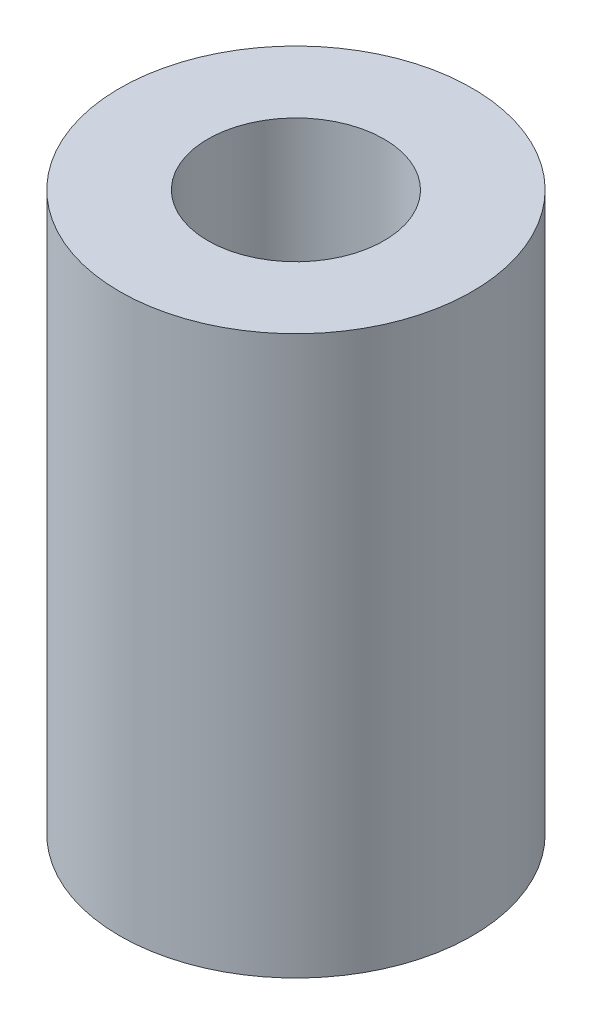
ISO-10303-21;
HEADER;
FILE_DESCRIPTION(('STEP AP214'),'2;1');
FILE_NAME('part.step','',(''),(''),'','','');
FILE_SCHEMA(('AUTOMOTIVE_DESIGN { 1 0 10303 214 1 1 1 1 }'));
ENDSEC;
DATA;
#1=APPLICATION_CONTEXT('core data for automotive mechanical design processes');
#2=APPLICATION_PROTOCOL_DEFINITION('international standard','automotive_design',2000,#1);
#3=PRODUCT_CONTEXT('',#1,'mechanical');
#4=PRODUCT('Part','Part','',(#3));
#5=PRODUCT_RELATED_PRODUCT_CATEGORY('part','',(#4));
#6=PRODUCT_DEFINITION_FORMATION('','',#4);
#7=PRODUCT_DEFINITION_CONTEXT('part definition',#1,'design');
#8=PRODUCT_DEFINITION('design','',#6,#7);
#9=PRODUCT_DEFINITION_SHAPE('','',#8);
#10=(LENGTH_UNIT() NAMED_UNIT(*) SI_UNIT(.MILLI.,.METRE.));
#11=(NAMED_UNIT(*) PLANE_ANGLE_UNIT() SI_UNIT($,.RADIAN.));
#12=(NAMED_UNIT(*) SI_UNIT($,.STERADIAN.) SOLID_ANGLE_UNIT());
#13=UNCERTAINTY_MEASURE_WITH_UNIT(LENGTH_MEASURE(1.E-05),#10,'distance_accuracy_value','');
#14=(GEOMETRIC_REPRESENTATION_CONTEXT(3) GLOBAL_UNCERTAINTY_ASSIGNED_CONTEXT((#13)) GLOBAL_UNIT_ASSIGNED_CONTEXT((#10,
#11,#12)) REPRESENTATION_CONTEXT('',''));
#15=CARTESIAN_POINT('',(0.,0.,0.));
#16=DIRECTION('',(0.,0.,1.));
#17=DIRECTION('',(1.,0.,0.));
#18=AXIS2_PLACEMENT_3D('',#15,#16,#17);
#19=CARTESIAN_POINT('',(0.,19.,0.));
#20=DIRECTION('',(0.,1.,0.));
#21=DIRECTION('',(0.,0.,1.));
#22=AXIS2_PLACEMENT_3D('',#19,#20,#21);
#23=PLANE('',#22);
#24=CARTESIAN_POINT('',(0.,19.,0.));
#25=DIRECTION('',(0.,1.,0.));
#26=DIRECTION('',(0.,0.,1.));
#27=AXIS2_PLACEMENT_3D('',#24,#25,#26);
#28=CIRCLE('',#27,6.);
#29=CARTESIAN_POINT('',(0.,19.,6.));
#30=VERTEX_POINT('',#29);
#31=EDGE_CURVE('E10',#30,#30,#28,.T.);
#32=ORIENTED_EDGE('',*,*,#31,.T.);
#33=EDGE_LOOP('',(#32));
#34=FACE_BOUND('',#33,.T.);
#35=CARTESIAN_POINT('',(0.,19.,0.));
#36=DIRECTION('',(0.,1.,0.));
#37=DIRECTION('',(0.,0.,1.));
#38=AXIS2_PLACEMENT_3D('',#35,#36,#37);
#39=CIRCLE('',#38,3.);
#40=CARTESIAN_POINT('',(0.,19.,3.));
#41=VERTEX_POINT('',#40);
#42=EDGE_CURVE('E41',#41,#41,#39,.T.);
#43=ORIENTED_EDGE('',*,*,#42,.F.);
#44=EDGE_LOOP('',(#43));
#45=FACE_BOUND('',#44,.T.);
#46=ADVANCED_FACE('F30',(#34,#45),#23,.T.);
#47=CARTESIAN_POINT('',(0.,0.,0.));
#48=DIRECTION('',(0.,1.,0.));
#49=DIRECTION('',(0.,0.,1.));
#50=AXIS2_PLACEMENT_3D('',#47,#48,#49);
#51=PLANE('',#50);
#52=CARTESIAN_POINT('',(0.,0.,0.));
#53=DIRECTION('',(0.,1.,0.));
#54=DIRECTION('',(0.,0.,1.));
#55=AXIS2_PLACEMENT_3D('',#52,#53,#54);
#56=CIRCLE('',#55,6.);
#57=CARTESIAN_POINT('',(0.,0.,6.));
#58=VERTEX_POINT('',#57);
#59=EDGE_CURVE('E34',#58,#58,#56,.T.);
#60=ORIENTED_EDGE('',*,*,#59,.F.);
#61=EDGE_LOOP('',(#60));
#62=FACE_BOUND('',#61,.T.);
#63=CARTESIAN_POINT('',(0.,0.,0.));
#64=DIRECTION('',(0.,1.,0.));
#65=DIRECTION('',(0.,0.,1.));
#66=AXIS2_PLACEMENT_3D('',#63,#64,#65);
#67=CIRCLE('',#66,3.);
#68=CARTESIAN_POINT('',(0.,0.,3.));
#69=VERTEX_POINT('',#68);
#70=EDGE_CURVE('E43',#69,#69,#67,.T.);
#71=ORIENTED_EDGE('',*,*,#70,.T.);
#72=EDGE_LOOP('',(#71));
#73=FACE_BOUND('',#72,.T.);
#74=ADVANCED_FACE('F53',(#62,#73),#51,.F.);
#75=CARTESIAN_POINT('',(0.,19.,0.));
#76=DIRECTION('',(0.,-1.,0.));
#77=DIRECTION('',(0.,0.,-1.));
#78=AXIS2_PLACEMENT_3D('',#75,#76,#77);
#79=CYLINDRICAL_SURFACE('',#78,6.);
#80=ORIENTED_EDGE('',*,*,#31,.F.);
#81=EDGE_LOOP('',(#80));
#82=FACE_BOUND('',#81,.T.);
#83=ORIENTED_EDGE('',*,*,#59,.T.);
#84=EDGE_LOOP('',(#83));
#85=FACE_BOUND('',#84,.T.);
#86=ADVANCED_FACE('F32',(#82,#85),#79,.T.);
#87=CARTESIAN_POINT('',(0.,19.,0.));
#88=DIRECTION('',(0.,-1.,0.));
#89=DIRECTION('',(0.,0.,-1.));
#90=AXIS2_PLACEMENT_3D('',#87,#88,#89);
#91=CYLINDRICAL_SURFACE('',#90,3.);
#92=ORIENTED_EDGE('',*,*,#42,.T.);
#93=EDGE_LOOP('',(#92));
#94=FACE_BOUND('',#93,.T.);
#95=ORIENTED_EDGE('',*,*,#70,.F.);
#96=EDGE_LOOP('',(#95));
#97=FACE_BOUND('',#96,.T.);
#98=ADVANCED_FACE('F49',(#94,#97),#91,.F.);
#99=CLOSED_SHELL('',(#46,#74,#86,#98));
#100=MANIFOLD_SOLID_BREP('B2',#99);
#101=ADVANCED_BREP_SHAPE_REPRESENTATION('',(#18,#100),#14);
#102=SHAPE_DEFINITION_REPRESENTATION(#9,#101);
ENDSEC;
END-ISO-10303-21;
